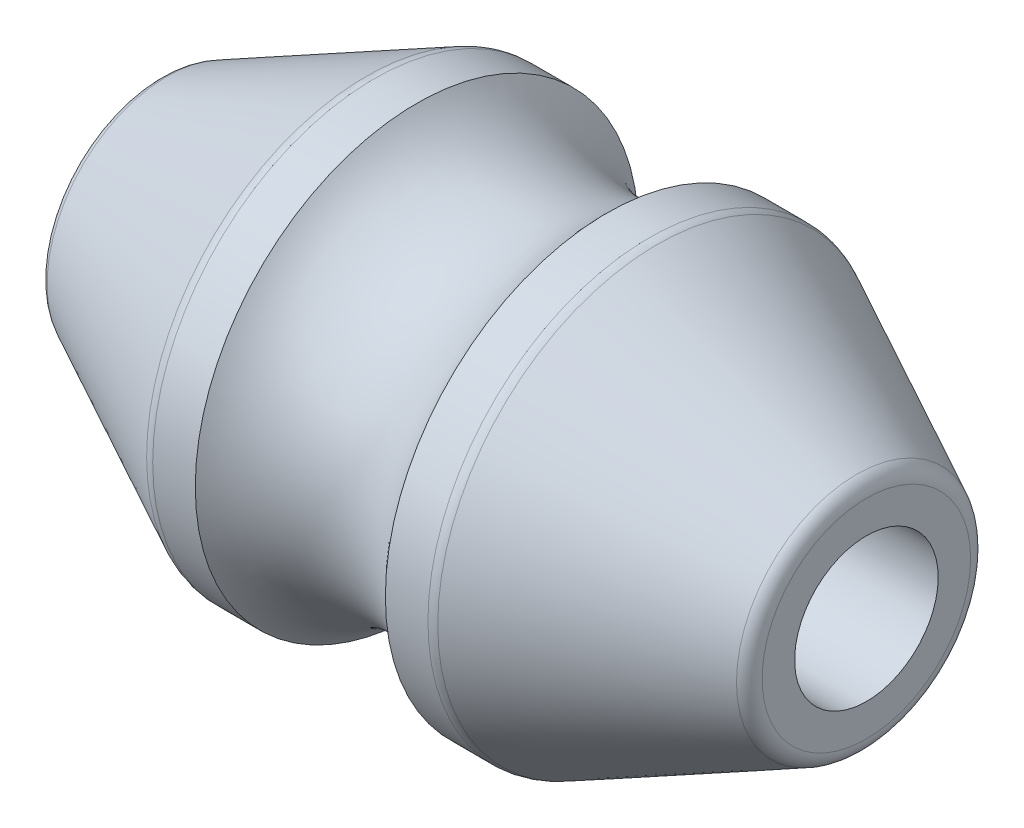
ISO-10303-21;
HEADER;
FILE_DESCRIPTION(('STEP AP214'),'2;1');
FILE_NAME('part.step','',(''),(''),'','','');
FILE_SCHEMA(('AUTOMOTIVE_DESIGN { 1 0 10303 214 1 1 1 1 }'));
ENDSEC;
DATA;
#1=APPLICATION_CONTEXT('core data for automotive mechanical design processes');
#2=APPLICATION_PROTOCOL_DEFINITION('international standard','automotive_design',2000,#1);
#3=PRODUCT_CONTEXT('',#1,'mechanical');
#4=PRODUCT('Part','Part','',(#3));
#5=PRODUCT_RELATED_PRODUCT_CATEGORY('part','',(#4));
#6=PRODUCT_DEFINITION_FORMATION('','',#4);
#7=PRODUCT_DEFINITION_CONTEXT('part definition',#1,'design');
#8=PRODUCT_DEFINITION('design','',#6,#7);
#9=PRODUCT_DEFINITION_SHAPE('','',#8);
#10=(LENGTH_UNIT() NAMED_UNIT(*) SI_UNIT(.MILLI.,.METRE.));
#11=(NAMED_UNIT(*) PLANE_ANGLE_UNIT() SI_UNIT($,.RADIAN.));
#12=(NAMED_UNIT(*) SI_UNIT($,.STERADIAN.) SOLID_ANGLE_UNIT());
#13=UNCERTAINTY_MEASURE_WITH_UNIT(LENGTH_MEASURE(1.E-05),#10,'distance_accuracy_value','');
#14=(GEOMETRIC_REPRESENTATION_CONTEXT(3) GLOBAL_UNCERTAINTY_ASSIGNED_CONTEXT((#13)) GLOBAL_UNIT_ASSIGNED_CONTEXT((#10,
#11,#12)) REPRESENTATION_CONTEXT('',''));
#15=CARTESIAN_POINT('',(0.,0.,0.));
#16=DIRECTION('',(0.,0.,1.));
#17=DIRECTION('',(1.,0.,0.));
#18=AXIS2_PLACEMENT_3D('',#15,#16,#17);
#19=CARTESIAN_POINT('',(20.,0.,0.));
#20=DIRECTION('',(-1.,0.,0.));
#21=DIRECTION('',(0.,0.,1.));
#22=AXIS2_PLACEMENT_3D('',#19,#20,#21);
#23=CYLINDRICAL_SURFACE('',#22,12.5);
#24=CARTESIAN_POINT('',(7.76393202250011,0.,0.));
#25=DIRECTION('',(1.,0.,0.));
#26=DIRECTION('',(0.,0.,-1.));
#27=AXIS2_PLACEMENT_3D('',#24,#25,#26);
#28=CIRCLE('',#27,12.5);
#29=CARTESIAN_POINT('',(7.76393202250011,0.,-12.5));
#30=VERTEX_POINT('',#29);
#31=EDGE_CURVE('E63',#30,#30,#28,.F.);
#32=ORIENTED_EDGE('',*,*,#31,.T.);
#33=EDGE_LOOP('',(#32));
#34=FACE_BOUND('',#33,.T.);
#35=CARTESIAN_POINT('',(5.3619026473818,0.,0.));
#36=DIRECTION('',(-1.,0.,0.));
#37=DIRECTION('',(0.,0.,1.));
#38=AXIS2_PLACEMENT_3D('',#35,#36,#37);
#39=CIRCLE('',#38,12.5);
#40=CARTESIAN_POINT('',(5.3619026473818,0.,12.5));
#41=VERTEX_POINT('',#40);
#42=EDGE_CURVE('E86',#41,#41,#39,.T.);
#43=ORIENTED_EDGE('',*,*,#42,.F.);
#44=EDGE_LOOP('',(#43));
#45=FACE_BOUND('',#44,.T.);
#46=ADVANCED_FACE('F45',(#34,#45),#23,.T.);
#47=CARTESIAN_POINT('',(-7.76393202250015,0.,0.));
#48=DIRECTION('',(-1.,0.,0.));
#49=DIRECTION('',(0.,0.,1.));
#50=AXIS2_PLACEMENT_3D('',#47,#48,#49);
#51=CIRCLE('',#50,12.5);
#52=CARTESIAN_POINT('',(-7.76393202250015,0.,12.5));
#53=VERTEX_POINT('',#52);
#54=EDGE_CURVE('E69',#53,#53,#51,.F.);
#55=ORIENTED_EDGE('',*,*,#54,.T.);
#56=EDGE_LOOP('',(#55));
#57=FACE_BOUND('',#56,.T.);
#58=CARTESIAN_POINT('',(-5.3619026473818,0.,0.));
#59=DIRECTION('',(1.,0.,0.));
#60=DIRECTION('',(0.,0.,-1.));
#61=AXIS2_PLACEMENT_3D('',#58,#59,#60);
#62=CIRCLE('',#61,12.5);
#63=CARTESIAN_POINT('',(-5.3619026473818,0.,-12.5));
#64=VERTEX_POINT('',#63);
#65=EDGE_CURVE('E91',#64,#64,#62,.T.);
#66=ORIENTED_EDGE('',*,*,#65,.F.);
#67=EDGE_LOOP('',(#66));
#68=FACE_BOUND('',#67,.T.);
#69=ADVANCED_FACE('F108',(#57,#68),#23,.T.);
#70=CARTESIAN_POINT('',(20.,0.,0.));
#71=DIRECTION('',(1.,0.,0.));
#72=DIRECTION('',(0.,0.,-1.));
#73=AXIS2_PLACEMENT_3D('',#70,#71,#72);
#74=PLANE('',#73);
#75=CARTESIAN_POINT('',(20.,0.,0.));
#76=DIRECTION('',(1.,0.,0.));
#77=DIRECTION('',(0.,0.,-1.));
#78=AXIS2_PLACEMENT_3D('',#75,#76,#77);
#79=CIRCLE('',#78,5.88196601125008);
#80=CARTESIAN_POINT('',(20.,0.,-5.88196601125008));
#81=VERTEX_POINT('',#80);
#82=EDGE_CURVE('E10',#81,#81,#79,.T.);
#83=ORIENTED_EDGE('',*,*,#82,.T.);
#84=EDGE_LOOP('',(#83));
#85=FACE_BOUND('',#84,.T.);
#86=CARTESIAN_POINT('',(20.,0.,0.));
#87=DIRECTION('',(1.,0.,0.));
#88=DIRECTION('',(0.,0.,-1.));
#89=AXIS2_PLACEMENT_3D('',#86,#87,#88);
#90=CIRCLE('',#89,4.05);
#91=CARTESIAN_POINT('',(20.,0.,-4.05));
#92=VERTEX_POINT('',#91);
#93=EDGE_CURVE('E85',#92,#92,#90,.T.);
#94=ORIENTED_EDGE('',*,*,#93,.F.);
#95=EDGE_LOOP('',(#94));
#96=FACE_BOUND('',#95,.T.);
#97=ADVANCED_FACE('F105',(#85,#96),#74,.T.);
#98=CARTESIAN_POINT('',(-20.,0.,0.));
#99=DIRECTION('',(1.,0.,0.));
#100=DIRECTION('',(0.,0.,-1.));
#101=AXIS2_PLACEMENT_3D('',#98,#99,#100);
#102=PLANE('',#101);
#103=CARTESIAN_POINT('',(-20.,0.,0.));
#104=DIRECTION('',(1.,0.,0.));
#105=DIRECTION('',(0.,0.,-1.));
#106=AXIS2_PLACEMENT_3D('',#103,#104,#105);
#107=CIRCLE('',#106,5.8819660112501);
#108=CARTESIAN_POINT('',(-20.,0.,-5.8819660112501));
#109=VERTEX_POINT('',#108);
#110=EDGE_CURVE('E81',#109,#109,#107,.F.);
#111=ORIENTED_EDGE('',*,*,#110,.T.);
#112=EDGE_LOOP('',(#111));
#113=FACE_BOUND('',#112,.T.);
#114=CARTESIAN_POINT('',(-20.,0.,0.));
#115=DIRECTION('',(1.,0.,0.));
#116=DIRECTION('',(0.,0.,-1.));
#117=AXIS2_PLACEMENT_3D('',#114,#115,#116);
#118=CIRCLE('',#117,4.05);
#119=CARTESIAN_POINT('',(-20.,0.,-4.05));
#120=VERTEX_POINT('',#119);
#121=EDGE_CURVE('E90',#120,#120,#118,.T.);
#122=ORIENTED_EDGE('',*,*,#121,.T.);
#123=EDGE_LOOP('',(#122));
#124=FACE_BOUND('',#123,.T.);
#125=ADVANCED_FACE('F107',(#113,#124),#102,.F.);
#126=CARTESIAN_POINT('',(20.,0.,0.));
#127=DIRECTION('',(-1.,0.,0.));
#128=DIRECTION('',(0.,0.,1.));
#129=AXIS2_PLACEMENT_3D('',#126,#127,#128);
#130=CYLINDRICAL_SURFACE('',#129,4.05);
#131=ORIENTED_EDGE('',*,*,#93,.T.);
#132=EDGE_LOOP('',(#131));
#133=FACE_BOUND('',#132,.T.);
#134=ORIENTED_EDGE('',*,*,#121,.F.);
#135=EDGE_LOOP('',(#134));
#136=FACE_BOUND('',#135,.T.);
#137=ADVANCED_FACE('F102',(#133,#136),#130,.F.);
#138=CARTESIAN_POINT('',(0.,0.,0.));
#139=DIRECTION('',(1.,0.,0.));
#140=DIRECTION('',(0.,0.,-1.));
#141=AXIS2_PLACEMENT_3D('',#138,#139,#140);
#142=TOROIDAL_SURFACE('',#141,17.,7.);
#143=ORIENTED_EDGE('',*,*,#65,.T.);
#144=EDGE_LOOP('',(#143));
#145=FACE_BOUND('',#144,.T.);
#146=ORIENTED_EDGE('',*,*,#42,.T.);
#147=EDGE_LOOP('',(#146));
#148=FACE_BOUND('',#147,.T.);
#149=ADVANCED_FACE('F134',(#145,#148),#142,.F.);
#150=CARTESIAN_POINT('',(-7.99999999999993,0.,0.));
#151=DIRECTION('',(1.,0.,0.));
#152=DIRECTION('',(0.,0.,-1.));
#153=AXIS2_PLACEMENT_3D('',#150,#151,#152);
#154=CONICAL_SURFACE('',#153,12.5,0.463647609000804);
#155=CARTESIAN_POINT('',(-19.4472135955,0.,0.));
#156=DIRECTION('',(1.,0.,0.));
#157=DIRECTION('',(0.,0.,-1.));
#158=AXIS2_PLACEMENT_3D('',#155,#156,#157);
#159=CIRCLE('',#158,6.77639320225002);
#160=CARTESIAN_POINT('',(-19.4472135955,0.,-6.77639320225002));
#161=VERTEX_POINT('',#160);
#162=EDGE_CURVE('E73',#161,#161,#159,.T.);
#163=ORIENTED_EDGE('',*,*,#162,.T.);
#164=EDGE_LOOP('',(#163));
#165=FACE_BOUND('',#164,.T.);
#166=CARTESIAN_POINT('',(-8.21114561800011,0.,0.));
#167=DIRECTION('',(1.,0.,0.));
#168=DIRECTION('',(0.,0.,-1.));
#169=AXIS2_PLACEMENT_3D('',#166,#167,#168);
#170=CIRCLE('',#169,12.3944271909999);
#171=CARTESIAN_POINT('',(-8.21114561800011,0.,-12.3944271909999));
#172=VERTEX_POINT('',#171);
#173=EDGE_CURVE('E77',#172,#172,#170,.F.);
#174=ORIENTED_EDGE('',*,*,#173,.T.);
#175=EDGE_LOOP('',(#174));
#176=FACE_BOUND('',#175,.T.);
#177=ADVANCED_FACE('F127',(#165,#176),#154,.T.);
#178=CARTESIAN_POINT('',(20.,0.,0.));
#179=DIRECTION('',(-1.,0.,0.));
#180=DIRECTION('',(0.,0.,1.));
#181=AXIS2_PLACEMENT_3D('',#178,#179,#180);
#182=CONICAL_SURFACE('',#181,6.49999999999998,0.463647609000804);
#183=CARTESIAN_POINT('',(8.21114561800007,0.,0.));
#184=DIRECTION('',(-1.,0.,0.));
#185=DIRECTION('',(0.,0.,1.));
#186=AXIS2_PLACEMENT_3D('',#183,#184,#185);
#187=CIRCLE('',#186,12.3944271909999);
#188=CARTESIAN_POINT('',(8.21114561800007,0.,12.3944271909999));
#189=VERTEX_POINT('',#188);
#190=EDGE_CURVE('E53',#189,#189,#187,.F.);
#191=ORIENTED_EDGE('',*,*,#190,.T.);
#192=EDGE_LOOP('',(#191));
#193=FACE_BOUND('',#192,.T.);
#194=CARTESIAN_POINT('',(19.4472135955,0.,0.));
#195=DIRECTION('',(1.,0.,0.));
#196=DIRECTION('',(0.,0.,-1.));
#197=AXIS2_PLACEMENT_3D('',#194,#195,#196);
#198=CIRCLE('',#197,6.77639320225);
#199=CARTESIAN_POINT('',(19.4472135955,0.,-6.77639320225));
#200=VERTEX_POINT('',#199);
#201=EDGE_CURVE('E58',#200,#200,#198,.F.);
#202=ORIENTED_EDGE('',*,*,#201,.T.);
#203=EDGE_LOOP('',(#202));
#204=FACE_BOUND('',#203,.T.);
#205=ADVANCED_FACE('F133',(#193,#204),#182,.T.);
#206=CARTESIAN_POINT('',(-19.,0.,0.));
#207=DIRECTION('',(1.,0.,0.));
#208=DIRECTION('',(0.,0.,-1.));
#209=AXIS2_PLACEMENT_3D('',#206,#207,#208);
#210=TOROIDAL_SURFACE('',#209,5.8819660112501,1.);
#211=ORIENTED_EDGE('',*,*,#162,.F.);
#212=EDGE_LOOP('',(#211));
#213=FACE_BOUND('',#212,.T.);
#214=ORIENTED_EDGE('',*,*,#110,.F.);
#215=EDGE_LOOP('',(#214));
#216=FACE_BOUND('',#215,.T.);
#217=ADVANCED_FACE('F140',(#213,#216),#210,.T.);
#218=CARTESIAN_POINT('',(-7.76393202250015,0.,0.));
#219=DIRECTION('',(-1.,0.,0.));
#220=DIRECTION('',(0.,0.,1.));
#221=AXIS2_PLACEMENT_3D('',#218,#219,#220);
#222=TOROIDAL_SURFACE('',#221,11.5,1.);
#223=ORIENTED_EDGE('',*,*,#173,.F.);
#224=EDGE_LOOP('',(#223));
#225=FACE_BOUND('',#224,.T.);
#226=ORIENTED_EDGE('',*,*,#54,.F.);
#227=EDGE_LOOP('',(#226));
#228=FACE_BOUND('',#227,.T.);
#229=ADVANCED_FACE('F143',(#225,#228),#222,.T.);
#230=CARTESIAN_POINT('',(7.76393202250011,0.,0.));
#231=DIRECTION('',(1.,0.,0.));
#232=DIRECTION('',(0.,0.,-1.));
#233=AXIS2_PLACEMENT_3D('',#230,#231,#232);
#234=TOROIDAL_SURFACE('',#233,11.5,1.);
#235=ORIENTED_EDGE('',*,*,#190,.F.);
#236=EDGE_LOOP('',(#235));
#237=FACE_BOUND('',#236,.T.);
#238=ORIENTED_EDGE('',*,*,#31,.F.);
#239=EDGE_LOOP('',(#238));
#240=FACE_BOUND('',#239,.T.);
#241=ADVANCED_FACE('F146',(#237,#240),#234,.T.);
#242=CARTESIAN_POINT('',(19.,0.,0.));
#243=DIRECTION('',(1.,0.,0.));
#244=DIRECTION('',(0.,0.,-1.));
#245=AXIS2_PLACEMENT_3D('',#242,#243,#244);
#246=TOROIDAL_SURFACE('',#245,5.88196601125008,1.);
#247=ORIENTED_EDGE('',*,*,#201,.F.);
#248=EDGE_LOOP('',(#247));
#249=FACE_BOUND('',#248,.T.);
#250=ORIENTED_EDGE('',*,*,#82,.F.);
#251=EDGE_LOOP('',(#250));
#252=FACE_BOUND('',#251,.T.);
#253=ADVANCED_FACE('F47',(#249,#252),#246,.T.);
#254=CLOSED_SHELL('',(#46,#69,#97,#125,#137,#149,#177,#205,#217,#229,#241,#253));
#255=MANIFOLD_SOLID_BREP('B2',#254);
#256=ADVANCED_BREP_SHAPE_REPRESENTATION('',(#18,#255),#14);
#257=SHAPE_DEFINITION_REPRESENTATION(#9,#256);
ENDSEC;
END-ISO-10303-21;
